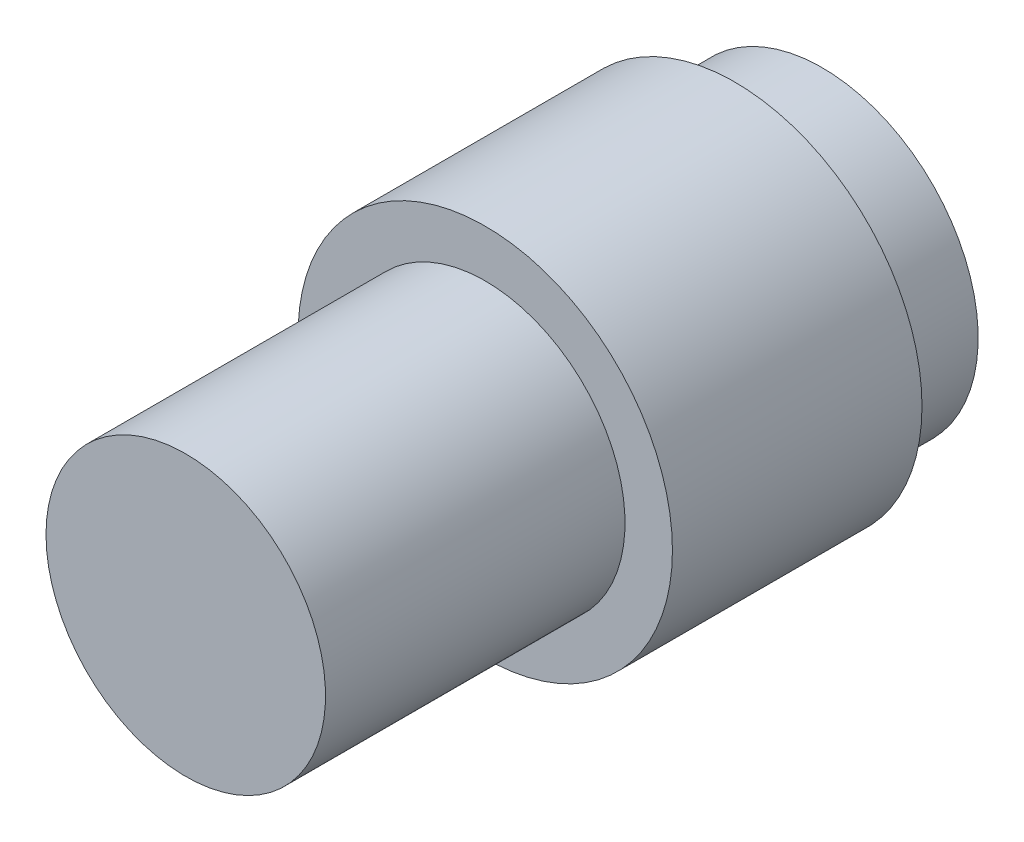
ISO-10303-21;
HEADER;
FILE_DESCRIPTION(('STEP AP214'),'2;1');
FILE_NAME('part.step','',(''),(''),'','','');
FILE_SCHEMA(('AUTOMOTIVE_DESIGN { 1 0 10303 214 1 1 1 1 }'));
ENDSEC;
DATA;
#1=APPLICATION_CONTEXT('core data for automotive mechanical design processes');
#2=APPLICATION_PROTOCOL_DEFINITION('international standard','automotive_design',2000,#1);
#3=PRODUCT_CONTEXT('',#1,'mechanical');
#4=PRODUCT('Part','Part','',(#3));
#5=PRODUCT_RELATED_PRODUCT_CATEGORY('part','',(#4));
#6=PRODUCT_DEFINITION_FORMATION('','',#4);
#7=PRODUCT_DEFINITION_CONTEXT('part definition',#1,'design');
#8=PRODUCT_DEFINITION('design','',#6,#7);
#9=PRODUCT_DEFINITION_SHAPE('','',#8);
#10=(LENGTH_UNIT() NAMED_UNIT(*) SI_UNIT(.MILLI.,.METRE.));
#11=(NAMED_UNIT(*) PLANE_ANGLE_UNIT() SI_UNIT($,.RADIAN.));
#12=(NAMED_UNIT(*) SI_UNIT($,.STERADIAN.) SOLID_ANGLE_UNIT());
#13=UNCERTAINTY_MEASURE_WITH_UNIT(LENGTH_MEASURE(1.E-05),#10,'distance_accuracy_value','');
#14=(GEOMETRIC_REPRESENTATION_CONTEXT(3) GLOBAL_UNCERTAINTY_ASSIGNED_CONTEXT((#13)) GLOBAL_UNIT_ASSIGNED_CONTEXT((#10,
#11,#12)) REPRESENTATION_CONTEXT('',''));
#15=CARTESIAN_POINT('',(0.,0.,0.));
#16=DIRECTION('',(0.,0.,1.));
#17=DIRECTION('',(1.,0.,0.));
#18=AXIS2_PLACEMENT_3D('',#15,#16,#17);
#19=CARTESIAN_POINT('',(0.,0.,2.54));
#20=DIRECTION('',(0.,0.,-1.));
#21=DIRECTION('',(-1.,0.,0.));
#22=AXIS2_PLACEMENT_3D('',#19,#20,#21);
#23=CYLINDRICAL_SURFACE('',#22,1.905);
#24=CARTESIAN_POINT('',(0.,0.,2.54));
#25=DIRECTION('',(0.,0.,1.));
#26=DIRECTION('',(1.,0.,0.));
#27=AXIS2_PLACEMENT_3D('',#24,#25,#26);
#28=CIRCLE('',#27,1.905);
#29=CARTESIAN_POINT('',(1.905,0.,2.54));
#30=VERTEX_POINT('',#29);
#31=EDGE_CURVE('E49',#30,#30,#28,.T.);
#32=ORIENTED_EDGE('',*,*,#31,.F.);
#33=EDGE_LOOP('',(#32));
#34=FACE_BOUND('',#33,.T.);
#35=CARTESIAN_POINT('',(0.,0.,0.));
#36=DIRECTION('',(0.,0.,1.));
#37=DIRECTION('',(1.,0.,0.));
#38=AXIS2_PLACEMENT_3D('',#35,#36,#37);
#39=CIRCLE('',#38,1.905);
#40=CARTESIAN_POINT('',(1.905,0.,0.));
#41=VERTEX_POINT('',#40);
#42=EDGE_CURVE('E40',#41,#41,#39,.T.);
#43=ORIENTED_EDGE('',*,*,#42,.T.);
#44=EDGE_LOOP('',(#43));
#45=FACE_BOUND('',#44,.T.);
#46=ADVANCED_FACE('F37',(#34,#45),#23,.T.);
#47=CARTESIAN_POINT('',(0.,0.,2.54));
#48=DIRECTION('',(0.,0.,1.));
#49=DIRECTION('',(1.,0.,0.));
#50=AXIS2_PLACEMENT_3D('',#47,#48,#49);
#51=PLANE('',#50);
#52=CARTESIAN_POINT('',(0.,0.,2.54));
#53=DIRECTION('',(0.,0.,1.));
#54=DIRECTION('',(1.,0.,0.));
#55=AXIS2_PLACEMENT_3D('',#52,#53,#54);
#56=CIRCLE('',#55,1.4224);
#57=CARTESIAN_POINT('',(-1.4224,0.,2.54));
#58=VERTEX_POINT('',#57);
#59=EDGE_CURVE('E44',#58,#58,#56,.T.);
#60=ORIENTED_EDGE('',*,*,#59,.F.);
#61=EDGE_LOOP('',(#60));
#62=FACE_BOUND('',#61,.T.);
#63=ORIENTED_EDGE('',*,*,#31,.T.);
#64=EDGE_LOOP('',(#63));
#65=FACE_BOUND('',#64,.T.);
#66=ADVANCED_FACE('F66',(#62,#65),#51,.T.);
#67=CARTESIAN_POINT('',(0.,0.,0.));
#68=DIRECTION('',(0.,0.,1.));
#69=DIRECTION('',(1.,0.,0.));
#70=AXIS2_PLACEMENT_3D('',#67,#68,#69);
#71=PLANE('',#70);
#72=CARTESIAN_POINT('',(0.,0.,0.));
#73=DIRECTION('',(0.,0.,-1.));
#74=DIRECTION('',(-1.,0.,0.));
#75=AXIS2_PLACEMENT_3D('',#72,#73,#74);
#76=CIRCLE('',#75,1.5875);
#77=CARTESIAN_POINT('',(-1.5875,0.,0.));
#78=VERTEX_POINT('',#77);
#79=EDGE_CURVE('E10',#78,#78,#76,.T.);
#80=ORIENTED_EDGE('',*,*,#79,.F.);
#81=EDGE_LOOP('',(#80));
#82=FACE_BOUND('',#81,.T.);
#83=ORIENTED_EDGE('',*,*,#42,.F.);
#84=EDGE_LOOP('',(#83));
#85=FACE_BOUND('',#84,.T.);
#86=ADVANCED_FACE('F63',(#82,#85),#71,.F.);
#87=CARTESIAN_POINT('',(0.,0.,5.588));
#88=DIRECTION('',(0.,0.,-1.));
#89=DIRECTION('',(-1.,0.,0.));
#90=AXIS2_PLACEMENT_3D('',#87,#88,#89);
#91=CYLINDRICAL_SURFACE('',#90,1.4224);
#92=CARTESIAN_POINT('',(0.,0.,5.588));
#93=DIRECTION('',(0.,0.,1.));
#94=DIRECTION('',(1.,0.,0.));
#95=AXIS2_PLACEMENT_3D('',#92,#93,#94);
#96=CIRCLE('',#95,1.4224);
#97=CARTESIAN_POINT('',(-1.4224,0.,5.588));
#98=VERTEX_POINT('',#97);
#99=EDGE_CURVE('E54',#98,#98,#96,.T.);
#100=CARTESIAN_POINT('',(-1.4224,0.,5.588));
#101=CARTESIAN_POINT('',(-1.4224,0.,5.55625));
#102=CARTESIAN_POINT('',(-1.4224,0.,5.5245));
#103=CARTESIAN_POINT('',(-1.4224,0.,5.461));
#104=CARTESIAN_POINT('',(-1.4224,0.,5.42925));
#105=CARTESIAN_POINT('',(-1.4224,0.,5.36575));
#106=CARTESIAN_POINT('',(-1.4224,0.,5.334));
#107=CARTESIAN_POINT('',(-1.4224,0.,5.2705));
#108=CARTESIAN_POINT('',(-1.4224,0.,5.23875));
#109=CARTESIAN_POINT('',(-1.4224,0.,5.17525));
#110=CARTESIAN_POINT('',(-1.4224,0.,5.1435));
#111=CARTESIAN_POINT('',(-1.4224,0.,5.08));
#112=CARTESIAN_POINT('',(-1.4224,0.,5.04825));
#113=CARTESIAN_POINT('',(-1.4224,0.,4.98475));
#114=CARTESIAN_POINT('',(-1.4224,0.,4.953));
#115=CARTESIAN_POINT('',(-1.4224,0.,4.8895));
#116=CARTESIAN_POINT('',(-1.4224,0.,4.85775));
#117=CARTESIAN_POINT('',(-1.4224,0.,4.79425));
#118=CARTESIAN_POINT('',(-1.4224,0.,4.7625));
#119=CARTESIAN_POINT('',(-1.4224,0.,4.699));
#120=CARTESIAN_POINT('',(-1.4224,0.,4.66725));
#121=CARTESIAN_POINT('',(-1.4224,0.,4.60375));
#122=CARTESIAN_POINT('',(-1.4224,0.,4.572));
#123=CARTESIAN_POINT('',(-1.4224,0.,4.5085));
#124=CARTESIAN_POINT('',(-1.4224,0.,4.47675));
#125=CARTESIAN_POINT('',(-1.4224,0.,4.41325));
#126=CARTESIAN_POINT('',(-1.4224,0.,4.3815));
#127=CARTESIAN_POINT('',(-1.4224,0.,4.318));
#128=CARTESIAN_POINT('',(-1.4224,0.,4.28625));
#129=CARTESIAN_POINT('',(-1.4224,0.,4.22275));
#130=CARTESIAN_POINT('',(-1.4224,0.,4.191));
#131=CARTESIAN_POINT('',(-1.4224,0.,4.1275));
#132=CARTESIAN_POINT('',(-1.4224,0.,4.09575));
#133=CARTESIAN_POINT('',(-1.4224,0.,4.03225));
#134=CARTESIAN_POINT('',(-1.4224,0.,4.0005));
#135=CARTESIAN_POINT('',(-1.4224,0.,3.937));
#136=CARTESIAN_POINT('',(-1.4224,0.,3.90525));
#137=CARTESIAN_POINT('',(-1.4224,0.,3.84175));
#138=CARTESIAN_POINT('',(-1.4224,0.,3.81));
#139=CARTESIAN_POINT('',(-1.4224,0.,3.7465));
#140=CARTESIAN_POINT('',(-1.4224,0.,3.71475));
#141=CARTESIAN_POINT('',(-1.4224,0.,3.65125));
#142=CARTESIAN_POINT('',(-1.4224,0.,3.6195));
#143=CARTESIAN_POINT('',(-1.4224,0.,3.556));
#144=CARTESIAN_POINT('',(-1.4224,0.,3.52425));
#145=CARTESIAN_POINT('',(-1.4224,0.,3.46075));
#146=CARTESIAN_POINT('',(-1.4224,0.,3.429));
#147=CARTESIAN_POINT('',(-1.4224,0.,3.3655));
#148=CARTESIAN_POINT('',(-1.4224,0.,3.33375));
#149=CARTESIAN_POINT('',(-1.4224,0.,3.27025));
#150=CARTESIAN_POINT('',(-1.4224,0.,3.2385));
#151=CARTESIAN_POINT('',(-1.4224,0.,3.175));
#152=CARTESIAN_POINT('',(-1.4224,0.,3.14325));
#153=CARTESIAN_POINT('',(-1.4224,0.,3.07975));
#154=CARTESIAN_POINT('',(-1.4224,0.,3.048));
#155=CARTESIAN_POINT('',(-1.4224,0.,2.9845));
#156=CARTESIAN_POINT('',(-1.4224,0.,2.95275));
#157=CARTESIAN_POINT('',(-1.4224,0.,2.88925));
#158=CARTESIAN_POINT('',(-1.4224,0.,2.8575));
#159=CARTESIAN_POINT('',(-1.4224,0.,2.794));
#160=CARTESIAN_POINT('',(-1.4224,0.,2.76225));
#161=CARTESIAN_POINT('',(-1.4224,0.,2.69875));
#162=CARTESIAN_POINT('',(-1.4224,0.,2.667));
#163=CARTESIAN_POINT('',(-1.4224,0.,2.6035));
#164=CARTESIAN_POINT('',(-1.4224,0.,2.57175));
#165=CARTESIAN_POINT('',(-1.4224,0.,2.54));
#166=B_SPLINE_CURVE_WITH_KNOTS('',3,(#100,#101,#102,#103,#104,#105,#106,#107,#108,#109,#110,
#111,#112,#113,#114,#115,#116,#117,#118,#119,#120,#121,#122,#123,#124,#125,#126,#127,#128,#129,
#130,#131,#132,#133,#134,#135,#136,#137,#138,#139,#140,#141,#142,#143,#144,#145,#146,#147,#148,
#149,#150,#151,#152,#153,#154,#155,#156,#157,#158,#159,#160,#161,#162,#163,#164,#165),
.UNSPECIFIED.,.F.,.F.,(4,2,2,2,2,2,2,2,2,2,2,2,2,2,2,2,2,2,2,2,2,2,2,2,2,2,2,2,2,2,2,2,4),(0.,
0.0952499999999998,0.1905,0.28575,0.380999999999999,0.476249999999999,0.571499999999999,0.66675,
0.762,0.85725,0.952499999999999,1.04775,1.143,1.23825,1.3335,1.42875,1.524,1.61925,1.7145,
1.80975,1.905,2.00025,2.0955,2.19075,2.286,2.38125,2.4765,2.57175,2.667,2.76225,2.8575,2.95275,
3.048),.UNSPECIFIED.);
#167=EDGE_CURVE('BSEAM65',#98,#58,#166,.T.);
#168=ORIENTED_EDGE('',*,*,#99,.F.);
#169=ORIENTED_EDGE('',*,*,#59,.T.);
#170=ORIENTED_EDGE('',*,*,#167,.T.);
#171=ORIENTED_EDGE('',*,*,#167,.F.);
#172=EDGE_LOOP('',(#168,#170,#169,#171));
#173=FACE_BOUND('',#172,.T.);
#174=ADVANCED_FACE('F65',(#173),#91,.T.);
#175=CARTESIAN_POINT('',(0.,0.,5.588));
#176=DIRECTION('',(0.,0.,1.));
#177=DIRECTION('',(1.,0.,0.));
#178=AXIS2_PLACEMENT_3D('',#175,#176,#177);
#179=PLANE('',#178);
#180=ORIENTED_EDGE('',*,*,#99,.T.);
#181=EDGE_LOOP('',(#180));
#182=FACE_BOUND('',#181,.T.);
#183=ADVANCED_FACE('F73',(#182),#179,.T.);
#184=CARTESIAN_POINT('',(0.,0.,-0.889));
#185=DIRECTION('',(0.,0.,1.));
#186=DIRECTION('',(1.,0.,0.));
#187=AXIS2_PLACEMENT_3D('',#184,#185,#186);
#188=CYLINDRICAL_SURFACE('',#187,1.5875);
#189=CARTESIAN_POINT('',(0.,0.,-0.889));
#190=DIRECTION('',(0.,0.,-1.));
#191=DIRECTION('',(-1.,0.,0.));
#192=AXIS2_PLACEMENT_3D('',#189,#190,#191);
#193=CIRCLE('',#192,1.5875);
#194=CARTESIAN_POINT('',(-1.5875,0.,-0.889));
#195=VERTEX_POINT('',#194);
#196=EDGE_CURVE('E53',#195,#195,#193,.T.);
#197=ORIENTED_EDGE('',*,*,#196,.F.);
#198=EDGE_LOOP('',(#197));
#199=FACE_BOUND('',#198,.T.);
#200=ORIENTED_EDGE('',*,*,#79,.T.);
#201=EDGE_LOOP('',(#200));
#202=FACE_BOUND('',#201,.T.);
#203=ADVANCED_FACE('F101',(#199,#202),#188,.T.);
#204=CARTESIAN_POINT('',(0.,0.,-0.889));
#205=DIRECTION('',(0.,0.,-1.));
#206=DIRECTION('',(-1.,0.,0.));
#207=AXIS2_PLACEMENT_3D('',#204,#205,#206);
#208=PLANE('',#207);
#209=ORIENTED_EDGE('',*,*,#196,.T.);
#210=EDGE_LOOP('',(#209));
#211=FACE_BOUND('',#210,.T.);
#212=ADVANCED_FACE('F108',(#211),#208,.T.);
#213=CLOSED_SHELL('',(#46,#66,#86,#174,#183,#203,#212));
#214=MANIFOLD_SOLID_BREP('B2',#213);
#215=ADVANCED_BREP_SHAPE_REPRESENTATION('',(#18,#214),#14);
#216=SHAPE_DEFINITION_REPRESENTATION(#9,#215);
ENDSEC;
END-ISO-10303-21;
